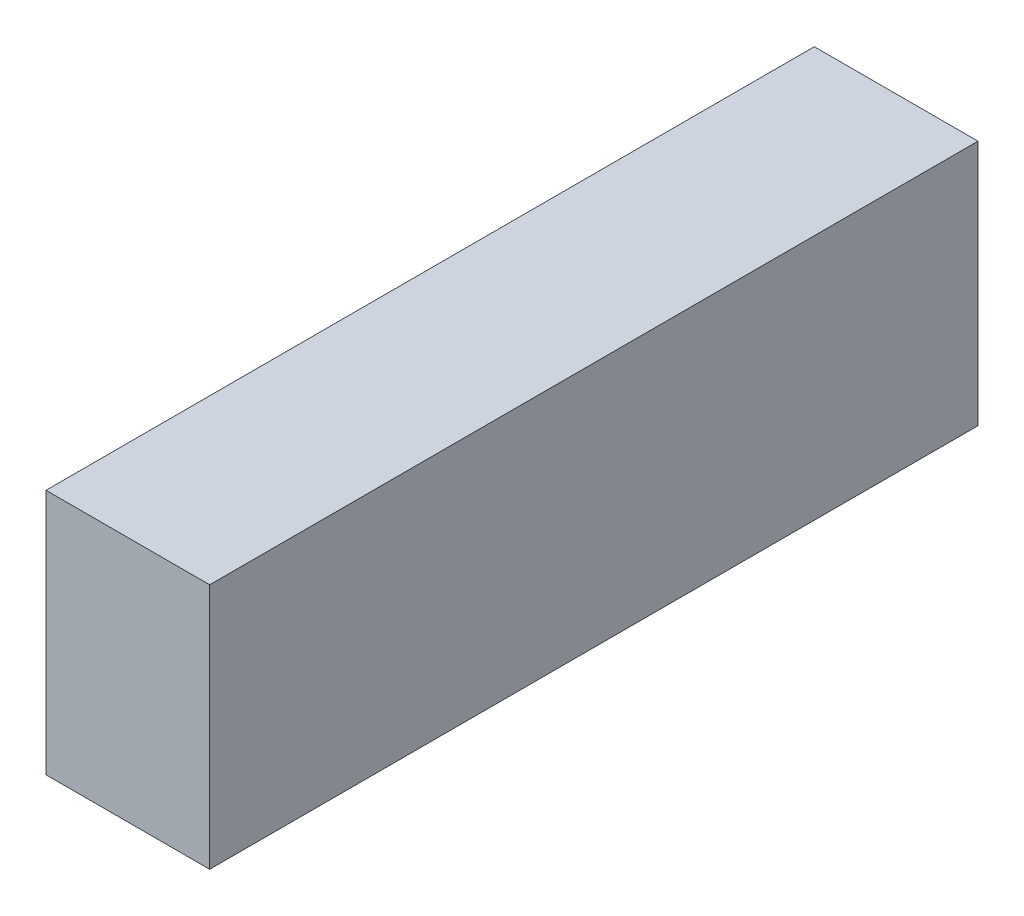
ISO-10303-21;
HEADER;
FILE_DESCRIPTION(('STEP AP214'),'2;1');
FILE_NAME('part.step','',(''),(''),'','','');
FILE_SCHEMA(('AUTOMOTIVE_DESIGN { 1 0 10303 214 1 1 1 1 }'));
ENDSEC;
DATA;
#1=APPLICATION_CONTEXT('core data for automotive mechanical design processes');
#2=APPLICATION_PROTOCOL_DEFINITION('international standard','automotive_design',2000,#1);
#3=PRODUCT_CONTEXT('',#1,'mechanical');
#4=PRODUCT('Part','Part','',(#3));
#5=PRODUCT_RELATED_PRODUCT_CATEGORY('part','',(#4));
#6=PRODUCT_DEFINITION_FORMATION('','',#4);
#7=PRODUCT_DEFINITION_CONTEXT('part definition',#1,'design');
#8=PRODUCT_DEFINITION('design','',#6,#7);
#9=PRODUCT_DEFINITION_SHAPE('','',#8);
#10=(LENGTH_UNIT() NAMED_UNIT(*) SI_UNIT(.MILLI.,.METRE.));
#11=(NAMED_UNIT(*) PLANE_ANGLE_UNIT() SI_UNIT($,.RADIAN.));
#12=(NAMED_UNIT(*) SI_UNIT($,.STERADIAN.) SOLID_ANGLE_UNIT());
#13=UNCERTAINTY_MEASURE_WITH_UNIT(LENGTH_MEASURE(1.E-05),#10,'distance_accuracy_value','');
#14=(GEOMETRIC_REPRESENTATION_CONTEXT(3) GLOBAL_UNCERTAINTY_ASSIGNED_CONTEXT((#13)) GLOBAL_UNIT_ASSIGNED_CONTEXT((#10,
#11,#12)) REPRESENTATION_CONTEXT('',''));
#15=CARTESIAN_POINT('',(0.,0.,0.));
#16=DIRECTION('',(0.,0.,1.));
#17=DIRECTION('',(1.,0.,0.));
#18=AXIS2_PLACEMENT_3D('',#15,#16,#17);
#19=CARTESIAN_POINT('',(19.511192891412,-5.977969005857,19.2));
#20=DIRECTION('',(0.,0.,-1.));
#21=DIRECTION('',(0.,-1.,0.));
#22=AXIS2_PLACEMENT_3D('',#19,#20,#21);
#23=PLANE('',#22);
#24=DIRECTION('',(1.,0.,0.));
#25=VECTOR('',#24,1.);
#26=CARTESIAN_POINT('',(19.404679402523,-5.817614572523,19.2));
#27=LINE('',#26,#25);
#28=CARTESIAN_POINT('',(19.404679402523,-5.817614572523,19.2));
#29=VERTEX_POINT('',#28);
#30=CARTESIAN_POINT('',(19.617706380301,-5.817614572523,19.2));
#31=VERTEX_POINT('',#30);
#32=EDGE_CURVE('E78',#29,#31,#27,.T.);
#33=ORIENTED_EDGE('',*,*,#32,.T.);
#34=DIRECTION('',(0.,-1.,0.));
#35=VECTOR('',#34,1.);
#36=CARTESIAN_POINT('',(19.617706380301,-5.817614572523,19.2));
#37=LINE('',#36,#35);
#38=CARTESIAN_POINT('',(19.617706380301,-6.13832343919,19.2));
#39=VERTEX_POINT('',#38);
#40=EDGE_CURVE('E84',#31,#39,#37,.T.);
#41=ORIENTED_EDGE('',*,*,#40,.T.);
#42=DIRECTION('',(-1.,0.,0.));
#43=VECTOR('',#42,1.);
#44=CARTESIAN_POINT('',(19.617706380301,-6.13832343919,19.2));
#45=LINE('',#44,#43);
#46=CARTESIAN_POINT('',(19.404679402523,-6.13832343919,19.2));
#47=VERTEX_POINT('',#46);
#48=EDGE_CURVE('E101',#39,#47,#45,.T.);
#49=ORIENTED_EDGE('',*,*,#48,.T.);
#50=DIRECTION('',(0.,1.,0.));
#51=VECTOR('',#50,1.);
#52=CARTESIAN_POINT('',(19.404679402523,-6.13832343919,19.2));
#53=LINE('',#52,#51);
#54=EDGE_CURVE('E11',#47,#29,#53,.T.);
#55=ORIENTED_EDGE('',*,*,#54,.T.);
#56=EDGE_LOOP('',(#33,#41,#49,#55));
#57=FACE_BOUND('',#56,.T.);
#58=ADVANCED_FACE('F16',(#57),#23,.T.);
#59=CARTESIAN_POINT('',(19.511192891412,-5.977969005857,20.2));
#60=DIRECTION('',(0.,0.,-1.));
#61=DIRECTION('',(0.,-1.,0.));
#62=AXIS2_PLACEMENT_3D('',#59,#60,#61);
#63=PLANE('',#62);
#64=DIRECTION('',(1.,0.,0.));
#65=VECTOR('',#64,1.);
#66=CARTESIAN_POINT('',(19.404679402523,-5.817614572523,20.2));
#67=LINE('',#66,#65);
#68=CARTESIAN_POINT('',(19.404679402523,-5.817614572523,20.2));
#69=VERTEX_POINT('',#68);
#70=CARTESIAN_POINT('',(19.617706380301,-5.817614572523,20.2));
#71=VERTEX_POINT('',#70);
#72=EDGE_CURVE('E69',#69,#71,#67,.T.);
#73=ORIENTED_EDGE('',*,*,#72,.F.);
#74=DIRECTION('',(0.,1.,0.));
#75=VECTOR('',#74,1.);
#76=CARTESIAN_POINT('',(19.404679402523,-6.13832343919,20.2));
#77=LINE('',#76,#75);
#78=CARTESIAN_POINT('',(19.404679402523,-6.13832343919,20.2));
#79=VERTEX_POINT('',#78);
#80=EDGE_CURVE('E27',#79,#69,#77,.T.);
#81=ORIENTED_EDGE('',*,*,#80,.F.);
#82=DIRECTION('',(-1.,0.,0.));
#83=VECTOR('',#82,1.);
#84=CARTESIAN_POINT('',(19.617706380301,-6.13832343919,20.2));
#85=LINE('',#84,#83);
#86=CARTESIAN_POINT('',(19.617706380301,-6.13832343919,20.2));
#87=VERTEX_POINT('',#86);
#88=EDGE_CURVE('E72',#87,#79,#85,.T.);
#89=ORIENTED_EDGE('',*,*,#88,.F.);
#90=DIRECTION('',(0.,-1.,0.));
#91=VECTOR('',#90,1.);
#92=CARTESIAN_POINT('',(19.617706380301,-5.817614572523,20.2));
#93=LINE('',#92,#91);
#94=EDGE_CURVE('E66',#71,#87,#93,.T.);
#95=ORIENTED_EDGE('',*,*,#94,.F.);
#96=EDGE_LOOP('',(#73,#81,#89,#95));
#97=FACE_BOUND('',#96,.T.);
#98=ADVANCED_FACE('F18',(#97),#63,.F.);
#99=CARTESIAN_POINT('',(19.404679402523,-5.9779690058565,19.19));
#100=DIRECTION('',(1.,0.,0.));
#101=DIRECTION('',(0.,1.,0.));
#102=AXIS2_PLACEMENT_3D('',#99,#100,#101);
#103=PLANE('',#102);
#104=DIRECTION('',(0.,0.,-1.));
#105=VECTOR('',#104,1.);
#106=CARTESIAN_POINT('',(19.404679402523,-6.13832343919,20.2));
#107=LINE('',#106,#105);
#108=EDGE_CURVE('E20',#79,#47,#107,.T.);
#109=ORIENTED_EDGE('',*,*,#108,.F.);
#110=ORIENTED_EDGE('',*,*,#80,.T.);
#111=DIRECTION('',(0.,0.,-1.));
#112=VECTOR('',#111,1.);
#113=CARTESIAN_POINT('',(19.404679402523,-5.817614572523,20.2));
#114=LINE('',#113,#112);
#115=EDGE_CURVE('E91',#69,#29,#114,.T.);
#116=ORIENTED_EDGE('',*,*,#115,.T.);
#117=ORIENTED_EDGE('',*,*,#54,.F.);
#118=EDGE_LOOP('',(#109,#110,#116,#117));
#119=FACE_BOUND('',#118,.T.);
#120=ADVANCED_FACE('F117',(#119),#103,.F.);
#121=CARTESIAN_POINT('',(19.511192891412,-6.13832343919,19.19));
#122=DIRECTION('',(0.,1.,0.));
#123=DIRECTION('',(1.,0.,0.));
#124=AXIS2_PLACEMENT_3D('',#121,#122,#123);
#125=PLANE('',#124);
#126=DIRECTION('',(0.,0.,-1.));
#127=VECTOR('',#126,1.);
#128=CARTESIAN_POINT('',(19.617706380301,-6.13832343919,20.2));
#129=LINE('',#128,#127);
#130=EDGE_CURVE('E77',#87,#39,#129,.T.);
#131=ORIENTED_EDGE('',*,*,#130,.F.);
#132=ORIENTED_EDGE('',*,*,#88,.T.);
#133=ORIENTED_EDGE('',*,*,#108,.T.);
#134=ORIENTED_EDGE('',*,*,#48,.F.);
#135=EDGE_LOOP('',(#131,#132,#133,#134));
#136=FACE_BOUND('',#135,.T.);
#137=ADVANCED_FACE('F116',(#136),#125,.F.);
#138=CARTESIAN_POINT('',(19.617706380301,-5.9779690058565,19.19));
#139=DIRECTION('',(-1.,0.,0.));
#140=DIRECTION('',(0.,0.,1.));
#141=AXIS2_PLACEMENT_3D('',#138,#139,#140);
#142=PLANE('',#141);
#143=DIRECTION('',(0.,0.,-1.));
#144=VECTOR('',#143,1.);
#145=CARTESIAN_POINT('',(19.617706380301,-5.817614572523,20.2));
#146=LINE('',#145,#144);
#147=EDGE_CURVE('E81',#71,#31,#146,.T.);
#148=ORIENTED_EDGE('',*,*,#147,.F.);
#149=ORIENTED_EDGE('',*,*,#94,.T.);
#150=ORIENTED_EDGE('',*,*,#130,.T.);
#151=ORIENTED_EDGE('',*,*,#40,.F.);
#152=EDGE_LOOP('',(#148,#149,#150,#151));
#153=FACE_BOUND('',#152,.T.);
#154=ADVANCED_FACE('F82',(#153),#142,.F.);
#155=CARTESIAN_POINT('',(19.511192891412,-5.817614572523,19.19));
#156=DIRECTION('',(0.,-1.,0.));
#157=DIRECTION('',(0.,0.,-1.));
#158=AXIS2_PLACEMENT_3D('',#155,#156,#157);
#159=PLANE('',#158);
#160=ORIENTED_EDGE('',*,*,#115,.F.);
#161=ORIENTED_EDGE('',*,*,#72,.T.);
#162=ORIENTED_EDGE('',*,*,#147,.T.);
#163=ORIENTED_EDGE('',*,*,#32,.F.);
#164=EDGE_LOOP('',(#160,#161,#162,#163));
#165=FACE_BOUND('',#164,.T.);
#166=ADVANCED_FACE('F90',(#165),#159,.F.);
#167=CLOSED_SHELL('',(#58,#98,#120,#137,#154,#166));
#168=MANIFOLD_SOLID_BREP('B1',#167);
#169=ADVANCED_BREP_SHAPE_REPRESENTATION('',(#18,#168),#14);
#170=SHAPE_DEFINITION_REPRESENTATION(#9,#169);
ENDSEC;
END-ISO-10303-21;
